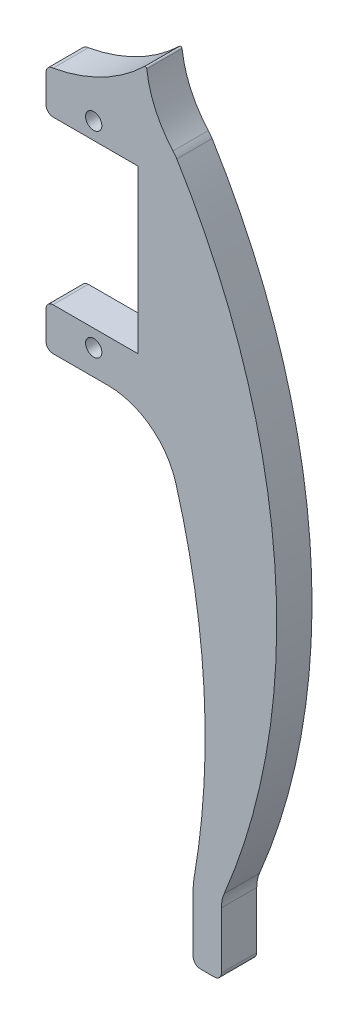
ISO-10303-21;
HEADER;
FILE_DESCRIPTION(('STEP AP214'),'2;1');
FILE_NAME('part.step','',(''),(''),'','','');
FILE_SCHEMA(('AUTOMOTIVE_DESIGN { 1 0 10303 214 1 1 1 1 }'));
ENDSEC;
DATA;
#1=APPLICATION_CONTEXT('core data for automotive mechanical design processes');
#2=APPLICATION_PROTOCOL_DEFINITION('international standard','automotive_design',2000,#1);
#3=PRODUCT_CONTEXT('',#1,'mechanical');
#4=PRODUCT('Part','Part','',(#3));
#5=PRODUCT_RELATED_PRODUCT_CATEGORY('part','',(#4));
#6=PRODUCT_DEFINITION_FORMATION('','',#4);
#7=PRODUCT_DEFINITION_CONTEXT('part definition',#1,'design');
#8=PRODUCT_DEFINITION('design','',#6,#7);
#9=PRODUCT_DEFINITION_SHAPE('','',#8);
#10=(LENGTH_UNIT() NAMED_UNIT(*) SI_UNIT(.MILLI.,.METRE.));
#11=(NAMED_UNIT(*) PLANE_ANGLE_UNIT() SI_UNIT($,.RADIAN.));
#12=(NAMED_UNIT(*) SI_UNIT($,.STERADIAN.) SOLID_ANGLE_UNIT());
#13=UNCERTAINTY_MEASURE_WITH_UNIT(LENGTH_MEASURE(1.E-05),#10,'distance_accuracy_value','');
#14=(GEOMETRIC_REPRESENTATION_CONTEXT(3) GLOBAL_UNCERTAINTY_ASSIGNED_CONTEXT((#13)) GLOBAL_UNIT_ASSIGNED_CONTEXT((#10,
#11,#12)) REPRESENTATION_CONTEXT('',''));
#15=CARTESIAN_POINT('',(0.,0.,0.));
#16=DIRECTION('',(0.,0.,1.));
#17=DIRECTION('',(1.,0.,0.));
#18=AXIS2_PLACEMENT_3D('',#15,#16,#17);
#19=CARTESIAN_POINT('',(-6.5,0.,5.));
#20=DIRECTION('',(-1.,0.,0.));
#21=DIRECTION('',(0.,0.,1.));
#22=AXIS2_PLACEMENT_3D('',#19,#20,#21);
#23=PLANE('',#22);
#24=DIRECTION('',(0.,1.,0.));
#25=VECTOR('',#24,1.);
#26=CARTESIAN_POINT('',(-6.5,0.,0.));
#27=LINE('',#26,#25);
#28=CARTESIAN_POINT('',(-6.5,12.5,0.));
#29=VERTEX_POINT('',#28);
#30=CARTESIAN_POINT('',(-6.5,16.5,0.));
#31=VERTEX_POINT('',#30);
#32=EDGE_CURVE('E302',#29,#31,#27,.T.);
#33=ORIENTED_EDGE('',*,*,#32,.F.);
#34=DIRECTION('',(0.,0.,-1.));
#35=VECTOR('',#34,1.);
#36=CARTESIAN_POINT('',(-6.5,12.5,5.));
#37=LINE('',#36,#35);
#38=CARTESIAN_POINT('',(-6.5,12.5,5.));
#39=VERTEX_POINT('',#38);
#40=EDGE_CURVE('E223',#29,#39,#37,.F.);
#41=ORIENTED_EDGE('',*,*,#40,.T.);
#42=DIRECTION('',(0.,1.,0.));
#43=VECTOR('',#42,1.);
#44=CARTESIAN_POINT('',(-6.5,0.,5.));
#45=LINE('',#44,#43);
#46=CARTESIAN_POINT('',(-6.5,16.5,5.));
#47=VERTEX_POINT('',#46);
#48=EDGE_CURVE('E308',#39,#47,#45,.T.);
#49=ORIENTED_EDGE('',*,*,#48,.T.);
#50=DIRECTION('',(0.,0.,-1.));
#51=VECTOR('',#50,1.);
#52=CARTESIAN_POINT('',(-6.5,16.5,5.));
#53=LINE('',#52,#51);
#54=EDGE_CURVE('E215',#47,#31,#53,.T.);
#55=ORIENTED_EDGE('',*,*,#54,.T.);
#56=EDGE_LOOP('',(#33,#41,#49,#55));
#57=FACE_BOUND('',#56,.T.);
#58=ADVANCED_FACE('F37',(#57),#23,.T.);
#59=CARTESIAN_POINT('',(0.,11.5,5.));
#60=DIRECTION('',(0.,1.,0.));
#61=DIRECTION('',(0.,0.,1.));
#62=AXIS2_PLACEMENT_3D('',#59,#60,#61);
#63=PLANE('',#62);
#64=DIRECTION('',(1.,0.,0.));
#65=VECTOR('',#64,1.);
#66=CARTESIAN_POINT('',(0.,11.5,5.));
#67=LINE('',#66,#65);
#68=CARTESIAN_POINT('',(-5.5,11.5,5.));
#69=VERTEX_POINT('',#68);
#70=CARTESIAN_POINT('',(6.5,11.5,5.));
#71=VERTEX_POINT('',#70);
#72=EDGE_CURVE('E310',#69,#71,#67,.T.);
#73=ORIENTED_EDGE('',*,*,#72,.F.);
#74=DIRECTION('',(0.,0.,-1.));
#75=VECTOR('',#74,1.);
#76=CARTESIAN_POINT('',(-5.5,11.5,0.));
#77=LINE('',#76,#75);
#78=CARTESIAN_POINT('',(-5.5,11.5,0.));
#79=VERTEX_POINT('',#78);
#80=EDGE_CURVE('E396',#69,#79,#77,.T.);
#81=ORIENTED_EDGE('',*,*,#80,.T.);
#82=DIRECTION('',(1.,0.,0.));
#83=VECTOR('',#82,1.);
#84=CARTESIAN_POINT('',(0.,11.5,0.));
#85=LINE('',#84,#83);
#86=CARTESIAN_POINT('',(6.5,11.5,0.));
#87=VERTEX_POINT('',#86);
#88=EDGE_CURVE('E339',#79,#87,#85,.T.);
#89=ORIENTED_EDGE('',*,*,#88,.T.);
#90=DIRECTION('',(0.,0.,-1.));
#91=VECTOR('',#90,1.);
#92=CARTESIAN_POINT('',(6.5,11.5,5.));
#93=LINE('',#92,#91);
#94=EDGE_CURVE('E366',#71,#87,#93,.T.);
#95=ORIENTED_EDGE('',*,*,#94,.F.);
#96=EDGE_LOOP('',(#73,#81,#89,#95));
#97=FACE_BOUND('',#96,.T.);
#98=ADVANCED_FACE('F409',(#97),#63,.F.);
#99=CARTESIAN_POINT('',(6.5,0.,5.));
#100=DIRECTION('',(1.,0.,0.));
#101=DIRECTION('',(0.,1.,0.));
#102=AXIS2_PLACEMENT_3D('',#99,#100,#101);
#103=PLANE('',#102);
#104=DIRECTION('',(0.,-1.,0.));
#105=VECTOR('',#104,1.);
#106=CARTESIAN_POINT('',(6.5,0.,0.));
#107=LINE('',#106,#105);
#108=CARTESIAN_POINT('',(6.5,-11.5,0.));
#109=VERTEX_POINT('',#108);
#110=EDGE_CURVE('E341',#87,#109,#107,.T.);
#111=ORIENTED_EDGE('',*,*,#110,.T.);
#112=DIRECTION('',(0.,0.,-1.));
#113=VECTOR('',#112,1.);
#114=CARTESIAN_POINT('',(6.5,-11.5,5.));
#115=LINE('',#114,#113);
#116=CARTESIAN_POINT('',(6.5,-11.5,5.));
#117=VERTEX_POINT('',#116);
#118=EDGE_CURVE('E337',#117,#109,#115,.T.);
#119=ORIENTED_EDGE('',*,*,#118,.F.);
#120=DIRECTION('',(0.,-1.,0.));
#121=VECTOR('',#120,1.);
#122=CARTESIAN_POINT('',(6.5,0.,5.));
#123=LINE('',#122,#121);
#124=EDGE_CURVE('E313',#71,#117,#123,.T.);
#125=ORIENTED_EDGE('',*,*,#124,.F.);
#126=ORIENTED_EDGE('',*,*,#94,.T.);
#127=EDGE_LOOP('',(#111,#119,#125,#126));
#128=FACE_BOUND('',#127,.T.);
#129=ADVANCED_FACE('F416',(#128),#103,.F.);
#130=CARTESIAN_POINT('',(0.,-11.5,5.));
#131=DIRECTION('',(0.,1.,0.));
#132=DIRECTION('',(0.,0.,1.));
#133=AXIS2_PLACEMENT_3D('',#130,#131,#132);
#134=PLANE('',#133);
#135=DIRECTION('',(1.,0.,0.));
#136=VECTOR('',#135,1.);
#137=CARTESIAN_POINT('',(0.,-11.5,0.));
#138=LINE('',#137,#136);
#139=CARTESIAN_POINT('',(-5.5,-11.5,0.));
#140=VERTEX_POINT('',#139);
#141=EDGE_CURVE('E344',#140,#109,#138,.T.);
#142=ORIENTED_EDGE('',*,*,#141,.F.);
#143=DIRECTION('',(0.,0.,-1.));
#144=VECTOR('',#143,1.);
#145=CARTESIAN_POINT('',(-5.5,-11.5,5.));
#146=LINE('',#145,#144);
#147=CARTESIAN_POINT('',(-5.5,-11.5,5.));
#148=VERTEX_POINT('',#147);
#149=EDGE_CURVE('E394',#140,#148,#146,.F.);
#150=ORIENTED_EDGE('',*,*,#149,.T.);
#151=DIRECTION('',(1.,0.,0.));
#152=VECTOR('',#151,1.);
#153=CARTESIAN_POINT('',(0.,-11.5,5.));
#154=LINE('',#153,#152);
#155=EDGE_CURVE('E316',#148,#117,#154,.T.);
#156=ORIENTED_EDGE('',*,*,#155,.T.);
#157=ORIENTED_EDGE('',*,*,#118,.T.);
#158=EDGE_LOOP('',(#142,#150,#156,#157));
#159=FACE_BOUND('',#158,.T.);
#160=ADVANCED_FACE('F419',(#159),#134,.T.);
#161=CARTESIAN_POINT('',(-6.5,0.,5.));
#162=DIRECTION('',(1.,0.,0.));
#163=DIRECTION('',(0.,1.,0.));
#164=AXIS2_PLACEMENT_3D('',#161,#162,#163);
#165=PLANE('',#164);
#166=DIRECTION('',(0.,-1.,0.));
#167=VECTOR('',#166,1.);
#168=CARTESIAN_POINT('',(-6.5,0.,0.));
#169=LINE('',#168,#167);
#170=CARTESIAN_POINT('',(-6.5,-12.5,0.));
#171=VERTEX_POINT('',#170);
#172=CARTESIAN_POINT('',(-6.5,-16.5,0.));
#173=VERTEX_POINT('',#172);
#174=EDGE_CURVE('E346',#171,#173,#169,.T.);
#175=ORIENTED_EDGE('',*,*,#174,.T.);
#176=DIRECTION('',(0.,0.,-1.));
#177=VECTOR('',#176,1.);
#178=CARTESIAN_POINT('',(-6.5,-16.5,5.));
#179=LINE('',#178,#177);
#180=CARTESIAN_POINT('',(-6.5,-16.5,5.));
#181=VERTEX_POINT('',#180);
#182=EDGE_CURVE('E217',#173,#181,#179,.F.);
#183=ORIENTED_EDGE('',*,*,#182,.T.);
#184=DIRECTION('',(0.,-1.,0.));
#185=VECTOR('',#184,1.);
#186=CARTESIAN_POINT('',(-6.5,0.,5.));
#187=LINE('',#186,#185);
#188=CARTESIAN_POINT('',(-6.5,-12.5,5.));
#189=VERTEX_POINT('',#188);
#190=EDGE_CURVE('E318',#189,#181,#187,.T.);
#191=ORIENTED_EDGE('',*,*,#190,.F.);
#192=DIRECTION('',(0.,0.,-1.));
#193=VECTOR('',#192,1.);
#194=CARTESIAN_POINT('',(-6.5,-12.5,0.));
#195=LINE('',#194,#193);
#196=EDGE_CURVE('E385',#189,#171,#195,.T.);
#197=ORIENTED_EDGE('',*,*,#196,.T.);
#198=EDGE_LOOP('',(#175,#183,#191,#197));
#199=FACE_BOUND('',#198,.T.);
#200=ADVANCED_FACE('F427',(#199),#165,.F.);
#201=CARTESIAN_POINT('',(0.,-17.5,5.));
#202=DIRECTION('',(0.,1.,0.));
#203=DIRECTION('',(0.,0.,1.));
#204=AXIS2_PLACEMENT_3D('',#201,#202,#203);
#205=PLANE('',#204);
#206=DIRECTION('',(1.,0.,0.));
#207=VECTOR('',#206,1.);
#208=CARTESIAN_POINT('',(0.,-17.5,0.));
#209=LINE('',#208,#207);
#210=CARTESIAN_POINT('',(-5.5,-17.5,0.));
#211=VERTEX_POINT('',#210);
#212=CARTESIAN_POINT('',(2.28345078270827,-17.5,0.));
#213=VERTEX_POINT('',#212);
#214=EDGE_CURVE('E349',#211,#213,#209,.T.);
#215=ORIENTED_EDGE('',*,*,#214,.T.);
#216=DIRECTION('',(0.,0.,1.));
#217=VECTOR('',#216,1.);
#218=CARTESIAN_POINT('',(2.28345078270827,-17.5,5.));
#219=LINE('',#218,#217);
#220=CARTESIAN_POINT('',(2.28345078270827,-17.5,5.));
#221=VERTEX_POINT('',#220);
#222=EDGE_CURVE('E270',#213,#221,#219,.T.);
#223=ORIENTED_EDGE('',*,*,#222,.T.);
#224=DIRECTION('',(1.,0.,0.));
#225=VECTOR('',#224,1.);
#226=CARTESIAN_POINT('',(0.,-17.5,5.));
#227=LINE('',#226,#225);
#228=CARTESIAN_POINT('',(-5.5,-17.5,5.));
#229=VERTEX_POINT('',#228);
#230=EDGE_CURVE('E321',#229,#221,#227,.T.);
#231=ORIENTED_EDGE('',*,*,#230,.F.);
#232=DIRECTION('',(0.,0.,-1.));
#233=VECTOR('',#232,1.);
#234=CARTESIAN_POINT('',(-5.5,-17.5,5.));
#235=LINE('',#234,#233);
#236=EDGE_CURVE('E375',#229,#211,#235,.T.);
#237=ORIENTED_EDGE('',*,*,#236,.T.);
#238=EDGE_LOOP('',(#215,#223,#231,#237));
#239=FACE_BOUND('',#238,.T.);
#240=ADVANCED_FACE('F436',(#239),#205,.F.);
#241=CARTESIAN_POINT('',(-88.0018123675898,-53.7710248991929,5.));
#242=DIRECTION('',(0.,0.,-1.));
#243=DIRECTION('',(-1.,0.,0.));
#244=AXIS2_PLACEMENT_3D('',#241,#242,#243);
#245=CYLINDRICAL_SURFACE('',#244,104.029758541499);
#246=CARTESIAN_POINT('',(-88.0018123675898,-53.7710248991929,5.));
#247=DIRECTION('',(0.,0.,1.));
#248=DIRECTION('',(1.,0.,0.));
#249=AXIS2_PLACEMENT_3D('',#246,#247,#248);
#250=CIRCLE('',#249,104.029758541499);
#251=CARTESIAN_POINT('',(11.8852262791807,-24.7060946123138,5.));
#252=VERTEX_POINT('',#251);
#253=CARTESIAN_POINT('',(14.4771935297143,-71.6663877762868,5.));
#254=VERTEX_POINT('',#253);
#255=EDGE_CURVE('E324',#252,#254,#250,.F.);
#256=ORIENTED_EDGE('',*,*,#255,.F.);
#257=DIRECTION('',(0.,0.,-1.));
#258=VECTOR('',#257,1.);
#259=CARTESIAN_POINT('',(11.8852262791807,-24.7060946123138,5.));
#260=LINE('',#259,#258);
#261=CARTESIAN_POINT('',(11.8852262791807,-24.7060946123138,0.));
#262=VERTEX_POINT('',#261);
#263=EDGE_CURVE('E267',#252,#262,#260,.T.);
#264=ORIENTED_EDGE('',*,*,#263,.T.);
#265=CARTESIAN_POINT('',(-88.0018123675898,-53.7710248991929,0.));
#266=DIRECTION('',(0.,0.,1.));
#267=DIRECTION('',(1.,0.,0.));
#268=AXIS2_PLACEMENT_3D('',#265,#266,#267);
#269=CIRCLE('',#268,104.029758541499);
#270=CARTESIAN_POINT('',(14.4771935297143,-71.6663877762868,0.));
#271=VERTEX_POINT('',#270);
#272=EDGE_CURVE('E352',#262,#271,#269,.F.);
#273=ORIENTED_EDGE('',*,*,#272,.T.);
#274=DIRECTION('',(0.,0.,-1.));
#275=VECTOR('',#274,1.);
#276=CARTESIAN_POINT('',(14.4771935297143,-71.6663877762868,5.));
#277=LINE('',#276,#275);
#278=EDGE_CURVE('E262',#271,#254,#277,.F.);
#279=ORIENTED_EDGE('',*,*,#278,.T.);
#280=EDGE_LOOP('',(#256,#264,#273,#279));
#281=FACE_BOUND('',#280,.T.);
#282=ADVANCED_FACE('F444',(#281),#245,.F.);
#283=CARTESIAN_POINT('',(14.3281253528836,0.,5.));
#284=DIRECTION('',(1.,0.,0.));
#285=DIRECTION('',(0.,1.,0.));
#286=AXIS2_PLACEMENT_3D('',#283,#284,#285);
#287=PLANE('',#286);
#288=DIRECTION('',(0.,-1.,0.));
#289=VECTOR('',#288,1.);
#290=CARTESIAN_POINT('',(14.3281253528836,0.,5.));
#291=LINE('',#290,#289);
#292=CARTESIAN_POINT('',(14.3281253528833,-73.3866035230104,5.));
#293=VERTEX_POINT('',#292);
#294=CARTESIAN_POINT('',(14.3281253528833,-81.5,5.));
#295=VERTEX_POINT('',#294);
#296=EDGE_CURVE('E326',#293,#295,#291,.T.);
#297=ORIENTED_EDGE('',*,*,#296,.F.);
#298=DIRECTION('',(0.,0.,-1.));
#299=VECTOR('',#298,1.);
#300=CARTESIAN_POINT('',(14.3281253528833,-73.3866035230104,5.));
#301=LINE('',#300,#299);
#302=CARTESIAN_POINT('',(14.3281253528833,-73.3866035230104,0.));
#303=VERTEX_POINT('',#302);
#304=EDGE_CURVE('E256',#293,#303,#301,.T.);
#305=ORIENTED_EDGE('',*,*,#304,.T.);
#306=DIRECTION('',(0.,-1.,0.));
#307=VECTOR('',#306,1.);
#308=CARTESIAN_POINT('',(14.3281253528836,0.,0.));
#309=LINE('',#308,#307);
#310=CARTESIAN_POINT('',(14.3281253528833,-81.5,0.));
#311=VERTEX_POINT('',#310);
#312=EDGE_CURVE('E354',#303,#311,#309,.T.);
#313=ORIENTED_EDGE('',*,*,#312,.T.);
#314=DIRECTION('',(0.,0.,-1.));
#315=VECTOR('',#314,1.);
#316=CARTESIAN_POINT('',(14.3281253528833,-81.5,5.));
#317=LINE('',#316,#315);
#318=EDGE_CURVE('E253',#311,#295,#317,.F.);
#319=ORIENTED_EDGE('',*,*,#318,.T.);
#320=EDGE_LOOP('',(#297,#305,#313,#319));
#321=FACE_BOUND('',#320,.T.);
#322=ADVANCED_FACE('F453',(#321),#287,.F.);
#323=CARTESIAN_POINT('',(0.,-82.5,5.));
#324=DIRECTION('',(0.,1.,0.));
#325=DIRECTION('',(0.,0.,1.));
#326=AXIS2_PLACEMENT_3D('',#323,#324,#325);
#327=PLANE('',#326);
#328=DIRECTION('',(1.,0.,0.));
#329=VECTOR('',#328,1.);
#330=CARTESIAN_POINT('',(0.,-82.5,0.));
#331=LINE('',#330,#329);
#332=CARTESIAN_POINT('',(15.3281253528833,-82.5,0.));
#333=VERTEX_POINT('',#332);
#334=CARTESIAN_POINT('',(17.3281253528833,-82.5,0.));
#335=VERTEX_POINT('',#334);
#336=EDGE_CURVE('E356',#333,#335,#331,.T.);
#337=ORIENTED_EDGE('',*,*,#336,.T.);
#338=DIRECTION('',(0.,0.,-1.));
#339=VECTOR('',#338,1.);
#340=CARTESIAN_POINT('',(17.3281253528833,-82.5,5.));
#341=LINE('',#340,#339);
#342=CARTESIAN_POINT('',(17.3281253528833,-82.5,5.));
#343=VERTEX_POINT('',#342);
#344=EDGE_CURVE('E247',#335,#343,#341,.F.);
#345=ORIENTED_EDGE('',*,*,#344,.T.);
#346=DIRECTION('',(1.,0.,0.));
#347=VECTOR('',#346,1.);
#348=CARTESIAN_POINT('',(0.,-82.5,5.));
#349=LINE('',#348,#347);
#350=CARTESIAN_POINT('',(15.3281253528833,-82.5,5.));
#351=VERTEX_POINT('',#350);
#352=EDGE_CURVE('E328',#351,#343,#349,.T.);
#353=ORIENTED_EDGE('',*,*,#352,.F.);
#354=DIRECTION('',(0.,0.,-1.));
#355=VECTOR('',#354,1.);
#356=CARTESIAN_POINT('',(15.3281253528833,-82.5,5.));
#357=LINE('',#356,#355);
#358=EDGE_CURVE('E244',#351,#333,#357,.T.);
#359=ORIENTED_EDGE('',*,*,#358,.T.);
#360=EDGE_LOOP('',(#337,#345,#353,#359));
#361=FACE_BOUND('',#360,.T.);
#362=ADVANCED_FACE('F463',(#361),#327,.F.);
#363=CARTESIAN_POINT('',(18.3281253528833,0.,5.));
#364=DIRECTION('',(1.,0.,0.));
#365=DIRECTION('',(0.,0.,-1.));
#366=AXIS2_PLACEMENT_3D('',#363,#364,#365);
#367=PLANE('',#366);
#368=DIRECTION('',(0.,-1.,0.));
#369=VECTOR('',#368,1.);
#370=CARTESIAN_POINT('',(18.3281253528833,0.,5.));
#371=LINE('',#370,#369);
#372=CARTESIAN_POINT('',(18.3281253528833,-73.5224752216835,5.));
#373=VERTEX_POINT('',#372);
#374=CARTESIAN_POINT('',(18.3281253528833,-81.5,5.));
#375=VERTEX_POINT('',#374);
#376=EDGE_CURVE('E331',#373,#375,#371,.T.);
#377=ORIENTED_EDGE('',*,*,#376,.T.);
#378=DIRECTION('',(0.,0.,-1.));
#379=VECTOR('',#378,1.);
#380=CARTESIAN_POINT('',(18.3281253528833,-81.5,0.));
#381=LINE('',#380,#379);
#382=CARTESIAN_POINT('',(18.3281253528833,-81.5,0.));
#383=VERTEX_POINT('',#382);
#384=EDGE_CURVE('E236',#375,#383,#381,.T.);
#385=ORIENTED_EDGE('',*,*,#384,.T.);
#386=DIRECTION('',(0.,-1.,0.));
#387=VECTOR('',#386,1.);
#388=CARTESIAN_POINT('',(18.3281253528833,0.,0.));
#389=LINE('',#388,#387);
#390=CARTESIAN_POINT('',(18.3281253528833,-73.5224752216835,0.));
#391=VERTEX_POINT('',#390);
#392=EDGE_CURVE('E359',#391,#383,#389,.T.);
#393=ORIENTED_EDGE('',*,*,#392,.F.);
#394=DIRECTION('',(0.,0.,1.));
#395=VECTOR('',#394,1.);
#396=CARTESIAN_POINT('',(18.3281253528833,-73.5224752216835,5.));
#397=LINE('',#396,#395);
#398=EDGE_CURVE('E226',#391,#373,#397,.T.);
#399=ORIENTED_EDGE('',*,*,#398,.T.);
#400=EDGE_LOOP('',(#377,#385,#393,#399));
#401=FACE_BOUND('',#400,.T.);
#402=ADVANCED_FACE('F472',(#401),#367,.T.);
#403=CARTESIAN_POINT('',(-68.8459826463385,-34.7418896852608,5.));
#404=DIRECTION('',(0.,0.,-1.));
#405=DIRECTION('',(-1.,0.,0.));
#406=AXIS2_PLACEMENT_3D('',#403,#404,#405);
#407=CYLINDRICAL_SURFACE('',#406,95.);
#408=CARTESIAN_POINT('',(-68.8459826463385,-34.7418896852608,5.));
#409=DIRECTION('',(0.,0.,1.));
#410=DIRECTION('',(1.,0.,0.));
#411=AXIS2_PLACEMENT_3D('',#408,#409,#410);
#412=CIRCLE('',#411,95.);
#413=CARTESIAN_POINT('',(12.0140090075523,15.1245494269589,5.));
#414=VERTEX_POINT('',#413);
#415=CARTESIAN_POINT('',(18.7194199529222,-71.5834459448623,5.));
#416=VERTEX_POINT('',#415);
#417=EDGE_CURVE('E334',#414,#416,#412,.F.);
#418=ORIENTED_EDGE('',*,*,#417,.T.);
#419=DIRECTION('',(0.,0.,-1.));
#420=VECTOR('',#419,1.);
#421=CARTESIAN_POINT('',(18.7194199529222,-71.5834459448623,5.));
#422=LINE('',#421,#420);
#423=CARTESIAN_POINT('',(18.7194199529222,-71.5834459448623,0.));
#424=VERTEX_POINT('',#423);
#425=EDGE_CURVE('E222',#416,#424,#422,.T.);
#426=ORIENTED_EDGE('',*,*,#425,.T.);
#427=CARTESIAN_POINT('',(-68.8459826463385,-34.7418896852608,0.));
#428=DIRECTION('',(0.,0.,1.));
#429=DIRECTION('',(1.,0.,0.));
#430=AXIS2_PLACEMENT_3D('',#427,#428,#429);
#431=CIRCLE('',#430,95.);
#432=CARTESIAN_POINT('',(12.0140090075523,15.1245494269589,0.));
#433=VERTEX_POINT('',#432);
#434=EDGE_CURVE('E311',#433,#424,#431,.F.);
#435=ORIENTED_EDGE('',*,*,#434,.F.);
#436=DIRECTION('',(0.,0.,-1.));
#437=VECTOR('',#436,1.);
#438=CARTESIAN_POINT('',(12.0140090075523,15.1245494269589,5.));
#439=LINE('',#438,#437);
#440=EDGE_CURVE('E371',#433,#414,#439,.F.);
#441=ORIENTED_EDGE('',*,*,#440,.T.);
#442=EDGE_LOOP('',(#418,#426,#435,#441));
#443=FACE_BOUND('',#442,.T.);
#444=ADVANCED_FACE('F480',(#443),#407,.T.);
#445=CARTESIAN_POINT('',(0.,0.,5.));
#446=DIRECTION('',(0.,0.,1.));
#447=DIRECTION('',(1.,0.,0.));
#448=AXIS2_PLACEMENT_3D('',#445,#446,#447);
#449=PLANE('',#448);
#450=CARTESIAN_POINT('',(0.249999999999999,13.9,5.));
#451=DIRECTION('',(0.,0.,1.));
#452=DIRECTION('',(1.,0.,0.));
#453=AXIS2_PLACEMENT_3D('',#450,#451,#452);
#454=CIRCLE('',#453,1.15);
#455=CARTESIAN_POINT('',(1.4,13.9,5.));
#456=VERTEX_POINT('',#455);
#457=EDGE_CURVE('E303',#456,#456,#454,.T.);
#458=ORIENTED_EDGE('',*,*,#457,.F.);
#459=EDGE_LOOP('',(#458));
#460=FACE_BOUND('',#459,.T.);
#461=CARTESIAN_POINT('',(0.249999999999999,-13.9,5.));
#462=DIRECTION('',(0.,0.,1.));
#463=DIRECTION('',(1.,0.,0.));
#464=AXIS2_PLACEMENT_3D('',#461,#462,#463);
#465=CIRCLE('',#464,1.15);
#466=CARTESIAN_POINT('',(1.4,-13.9,5.));
#467=VERTEX_POINT('',#466);
#468=EDGE_CURVE('E293',#467,#467,#465,.T.);
#469=ORIENTED_EDGE('',*,*,#468,.F.);
#470=EDGE_LOOP('',(#469));
#471=FACE_BOUND('',#470,.T.);
#472=CARTESIAN_POINT('',(7.75821997313698,12.5,5.));
#473=DIRECTION('',(0.,0.,1.));
#474=DIRECTION('',(1.,0.,0.));
#475=AXIS2_PLACEMENT_3D('',#472,#473,#474);
#476=CIRCLE('',#475,5.);
#477=CARTESIAN_POINT('',(11.4804823789559,15.8383772378548,5.));
#478=VERTEX_POINT('',#477);
#479=EDGE_CURVE('E373',#414,#478,#476,.T.);
#480=ORIENTED_EDGE('',*,*,#479,.T.);
#481=CARTESIAN_POINT('',(22.6472695964127,25.8535089514193,5.));
#482=DIRECTION('',(0.,0.,1.));
#483=DIRECTION('',(1.,0.,0.));
#484=AXIS2_PLACEMENT_3D('',#481,#482,#483);
#485=CIRCLE('',#484,15.);
#486=CARTESIAN_POINT('',(7.75676009975903,24.0444409786586,5.));
#487=VERTEX_POINT('',#486);
#488=EDGE_CURVE('E11',#478,#487,#485,.F.);
#489=ORIENTED_EDGE('',*,*,#488,.T.);
#490=CARTESIAN_POINT('',(7.55821997313699,24.0203200723552,5.));
#491=DIRECTION('',(0.,0.,1.));
#492=DIRECTION('',(1.,0.,0.));
#493=AXIS2_PLACEMENT_3D('',#490,#491,#492);
#494=CIRCLE('',#493,0.2);
#495=CARTESIAN_POINT('',(7.41882018568872,24.163734504193,5.));
#496=VERTEX_POINT('',#495);
#497=EDGE_CURVE('E203',#487,#496,#494,.T.);
#498=ORIENTED_EDGE('',*,*,#497,.T.);
#499=CARTESIAN_POINT('',(-10.0061532453444,42.0905384839265,5.));
#500=DIRECTION('',(0.,0.,-1.));
#501=DIRECTION('',(1.,0.,0.));
#502=AXIS2_PLACEMENT_3D('',#499,#500,#501);
#503=CIRCLE('',#502,25.);
#504=CARTESIAN_POINT('',(-5.5,17.5,5.));
#505=VERTEX_POINT('',#504);
#506=EDGE_CURVE('E196',#496,#505,#503,.T.);
#507=ORIENTED_EDGE('',*,*,#506,.T.);
#508=CARTESIAN_POINT('',(-5.5,16.5,5.));
#509=DIRECTION('',(0.,0.,1.));
#510=DIRECTION('',(1.,0.,0.));
#511=AXIS2_PLACEMENT_3D('',#508,#509,#510);
#512=CIRCLE('',#511,1.);
#513=EDGE_CURVE('E200',#505,#47,#512,.T.);
#514=ORIENTED_EDGE('',*,*,#513,.T.);
#515=ORIENTED_EDGE('',*,*,#48,.F.);
#516=CARTESIAN_POINT('',(-5.5,12.5,5.));
#517=DIRECTION('',(0.,0.,1.));
#518=DIRECTION('',(1.,0.,0.));
#519=AXIS2_PLACEMENT_3D('',#516,#517,#518);
#520=CIRCLE('',#519,1.);
#521=EDGE_CURVE('E216',#39,#69,#520,.T.);
#522=ORIENTED_EDGE('',*,*,#521,.T.);
#523=ORIENTED_EDGE('',*,*,#72,.T.);
#524=ORIENTED_EDGE('',*,*,#124,.T.);
#525=ORIENTED_EDGE('',*,*,#155,.F.);
#526=CARTESIAN_POINT('',(-5.5,-12.5,5.));
#527=DIRECTION('',(0.,0.,1.));
#528=DIRECTION('',(1.,0.,0.));
#529=AXIS2_PLACEMENT_3D('',#526,#527,#528);
#530=CIRCLE('',#529,1.);
#531=EDGE_CURVE('E390',#148,#189,#530,.T.);
#532=ORIENTED_EDGE('',*,*,#531,.T.);
#533=ORIENTED_EDGE('',*,*,#190,.T.);
#534=CARTESIAN_POINT('',(-5.5,-16.5,5.));
#535=DIRECTION('',(0.,0.,1.));
#536=DIRECTION('',(1.,0.,0.));
#537=AXIS2_PLACEMENT_3D('',#534,#535,#536);
#538=CIRCLE('',#537,1.);
#539=EDGE_CURVE('E392',#181,#229,#538,.T.);
#540=ORIENTED_EDGE('',*,*,#539,.T.);
#541=ORIENTED_EDGE('',*,*,#230,.T.);
#542=CARTESIAN_POINT('',(2.28345078270827,-27.5,5.));
#543=DIRECTION('',(0.,0.,1.));
#544=DIRECTION('',(1.,0.,0.));
#545=AXIS2_PLACEMENT_3D('',#542,#543,#544);
#546=CIRCLE('',#545,10.);
#547=EDGE_CURVE('E274',#221,#252,#546,.F.);
#548=ORIENTED_EDGE('',*,*,#547,.T.);
#549=ORIENTED_EDGE('',*,*,#255,.T.);
#550=CARTESIAN_POINT('',(24.3281253528833,-73.3866035230104,5.));
#551=DIRECTION('',(0.,0.,1.));
#552=DIRECTION('',(1.,0.,0.));
#553=AXIS2_PLACEMENT_3D('',#550,#551,#552);
#554=CIRCLE('',#553,10.);
#555=EDGE_CURVE('E265',#254,#293,#554,.T.);
#556=ORIENTED_EDGE('',*,*,#555,.T.);
#557=ORIENTED_EDGE('',*,*,#296,.T.);
#558=CARTESIAN_POINT('',(15.3281253528833,-81.5,5.));
#559=DIRECTION('',(0.,0.,1.));
#560=DIRECTION('',(1.,0.,0.));
#561=AXIS2_PLACEMENT_3D('',#558,#559,#560);
#562=CIRCLE('',#561,1.);
#563=EDGE_CURVE('E249',#295,#351,#562,.T.);
#564=ORIENTED_EDGE('',*,*,#563,.T.);
#565=ORIENTED_EDGE('',*,*,#352,.T.);
#566=CARTESIAN_POINT('',(17.3281253528833,-81.5,5.));
#567=DIRECTION('',(0.,0.,1.));
#568=DIRECTION('',(1.,0.,0.));
#569=AXIS2_PLACEMENT_3D('',#566,#567,#568);
#570=CIRCLE('',#569,1.);
#571=EDGE_CURVE('E251',#343,#375,#570,.T.);
#572=ORIENTED_EDGE('',*,*,#571,.T.);
#573=ORIENTED_EDGE('',*,*,#376,.F.);
#574=CARTESIAN_POINT('',(23.3281253528833,-73.5224752216835,5.));
#575=DIRECTION('',(0.,0.,1.));
#576=DIRECTION('',(1.,0.,0.));
#577=AXIS2_PLACEMENT_3D('',#574,#575,#576);
#578=CIRCLE('',#577,5.);
#579=EDGE_CURVE('E234',#373,#416,#578,.F.);
#580=ORIENTED_EDGE('',*,*,#579,.T.);
#581=ORIENTED_EDGE('',*,*,#417,.F.);
#582=EDGE_LOOP('',(#480,#489,#498,#507,#514,#515,#522,#523,#524,#525,#532,#533,#540,#541,#548,
#549,#556,#557,#564,#565,#572,#573,#580,#581));
#583=FACE_BOUND('',#582,.T.);
#584=ADVANCED_FACE('F198',(#460,#471,#583),#449,.T.);
#585=CARTESIAN_POINT('',(0.,0.,0.));
#586=DIRECTION('',(0.,0.,1.));
#587=DIRECTION('',(1.,0.,0.));
#588=AXIS2_PLACEMENT_3D('',#585,#586,#587);
#589=PLANE('',#588);
#590=CARTESIAN_POINT('',(0.249999999999999,13.9,0.));
#591=DIRECTION('',(0.,0.,1.));
#592=DIRECTION('',(1.,0.,0.));
#593=AXIS2_PLACEMENT_3D('',#590,#591,#592);
#594=CIRCLE('',#593,1.15);
#595=CARTESIAN_POINT('',(1.4,13.9,0.));
#596=VERTEX_POINT('',#595);
#597=EDGE_CURVE('E299',#596,#596,#594,.T.);
#598=ORIENTED_EDGE('',*,*,#597,.T.);
#599=EDGE_LOOP('',(#598));
#600=FACE_BOUND('',#599,.T.);
#601=CARTESIAN_POINT('',(0.249999999999999,-13.9,0.));
#602=DIRECTION('',(0.,0.,1.));
#603=DIRECTION('',(1.,0.,0.));
#604=AXIS2_PLACEMENT_3D('',#601,#602,#603);
#605=CIRCLE('',#604,1.15);
#606=CARTESIAN_POINT('',(1.4,-13.9,0.));
#607=VERTEX_POINT('',#606);
#608=EDGE_CURVE('E296',#607,#607,#605,.T.);
#609=ORIENTED_EDGE('',*,*,#608,.T.);
#610=EDGE_LOOP('',(#609));
#611=FACE_BOUND('',#610,.T.);
#612=CARTESIAN_POINT('',(-10.0061532453444,42.0905384839265,0.));
#613=DIRECTION('',(0.,0.,-1.));
#614=DIRECTION('',(1.,0.,0.));
#615=AXIS2_PLACEMENT_3D('',#612,#613,#614);
#616=CIRCLE('',#615,25.);
#617=CARTESIAN_POINT('',(7.41882018568872,24.163734504193,0.));
#618=VERTEX_POINT('',#617);
#619=CARTESIAN_POINT('',(-5.5,17.5,0.));
#620=VERTEX_POINT('',#619);
#621=EDGE_CURVE('E207',#618,#620,#616,.T.);
#622=ORIENTED_EDGE('',*,*,#621,.F.);
#623=CARTESIAN_POINT('',(7.55821997313699,24.0203200723552,0.));
#624=DIRECTION('',(0.,0.,1.));
#625=DIRECTION('',(1.,0.,0.));
#626=AXIS2_PLACEMENT_3D('',#623,#624,#625);
#627=CIRCLE('',#626,0.2);
#628=CARTESIAN_POINT('',(7.75676009975903,24.0444409786586,0.));
#629=VERTEX_POINT('',#628);
#630=EDGE_CURVE('E279',#618,#629,#627,.F.);
#631=ORIENTED_EDGE('',*,*,#630,.T.);
#632=CARTESIAN_POINT('',(22.6472695964127,25.8535089514193,0.));
#633=DIRECTION('',(0.,0.,1.));
#634=DIRECTION('',(1.,0.,0.));
#635=AXIS2_PLACEMENT_3D('',#632,#633,#634);
#636=CIRCLE('',#635,15.);
#637=CARTESIAN_POINT('',(11.4804823789559,15.8383772378548,0.));
#638=VERTEX_POINT('',#637);
#639=EDGE_CURVE('E45',#629,#638,#636,.T.);
#640=ORIENTED_EDGE('',*,*,#639,.T.);
#641=CARTESIAN_POINT('',(7.75821997313698,12.5,0.));
#642=DIRECTION('',(0.,0.,1.));
#643=DIRECTION('',(1.,0.,0.));
#644=AXIS2_PLACEMENT_3D('',#641,#642,#643);
#645=CIRCLE('',#644,5.);
#646=EDGE_CURVE('E369',#638,#433,#645,.F.);
#647=ORIENTED_EDGE('',*,*,#646,.T.);
#648=ORIENTED_EDGE('',*,*,#434,.T.);
#649=CARTESIAN_POINT('',(23.3281253528833,-73.5224752216835,0.));
#650=DIRECTION('',(0.,0.,1.));
#651=DIRECTION('',(1.,0.,0.));
#652=AXIS2_PLACEMENT_3D('',#649,#650,#651);
#653=CIRCLE('',#652,5.);
#654=EDGE_CURVE('E232',#424,#391,#653,.T.);
#655=ORIENTED_EDGE('',*,*,#654,.T.);
#656=ORIENTED_EDGE('',*,*,#392,.T.);
#657=CARTESIAN_POINT('',(17.3281253528833,-81.5,0.));
#658=DIRECTION('',(0.,0.,1.));
#659=DIRECTION('',(1.,0.,0.));
#660=AXIS2_PLACEMENT_3D('',#657,#658,#659);
#661=CIRCLE('',#660,1.);
#662=EDGE_CURVE('E242',#383,#335,#661,.F.);
#663=ORIENTED_EDGE('',*,*,#662,.T.);
#664=ORIENTED_EDGE('',*,*,#336,.F.);
#665=CARTESIAN_POINT('',(15.3281253528833,-81.5,0.));
#666=DIRECTION('',(0.,0.,1.));
#667=DIRECTION('',(1.,0.,0.));
#668=AXIS2_PLACEMENT_3D('',#665,#666,#667);
#669=CIRCLE('',#668,1.);
#670=EDGE_CURVE('E239',#333,#311,#669,.F.);
#671=ORIENTED_EDGE('',*,*,#670,.T.);
#672=ORIENTED_EDGE('',*,*,#312,.F.);
#673=CARTESIAN_POINT('',(24.3281253528833,-73.3866035230104,0.));
#674=DIRECTION('',(0.,0.,1.));
#675=DIRECTION('',(1.,0.,0.));
#676=AXIS2_PLACEMENT_3D('',#673,#674,#675);
#677=CIRCLE('',#676,10.);
#678=EDGE_CURVE('E259',#303,#271,#677,.F.);
#679=ORIENTED_EDGE('',*,*,#678,.T.);
#680=ORIENTED_EDGE('',*,*,#272,.F.);
#681=CARTESIAN_POINT('',(2.28345078270827,-27.5,0.));
#682=DIRECTION('',(0.,0.,1.));
#683=DIRECTION('',(1.,0.,0.));
#684=AXIS2_PLACEMENT_3D('',#681,#682,#683);
#685=CIRCLE('',#684,10.);
#686=EDGE_CURVE('E272',#262,#213,#685,.T.);
#687=ORIENTED_EDGE('',*,*,#686,.T.);
#688=ORIENTED_EDGE('',*,*,#214,.F.);
#689=CARTESIAN_POINT('',(-5.5,-16.5,0.));
#690=DIRECTION('',(0.,0.,1.));
#691=DIRECTION('',(1.,0.,0.));
#692=AXIS2_PLACEMENT_3D('',#689,#690,#691);
#693=CIRCLE('',#692,1.);
#694=EDGE_CURVE('E383',#211,#173,#693,.F.);
#695=ORIENTED_EDGE('',*,*,#694,.T.);
#696=ORIENTED_EDGE('',*,*,#174,.F.);
#697=CARTESIAN_POINT('',(-5.5,-12.5,0.));
#698=DIRECTION('',(0.,0.,1.));
#699=DIRECTION('',(1.,0.,0.));
#700=AXIS2_PLACEMENT_3D('',#697,#698,#699);
#701=CIRCLE('',#700,1.);
#702=EDGE_CURVE('E381',#171,#140,#701,.F.);
#703=ORIENTED_EDGE('',*,*,#702,.T.);
#704=ORIENTED_EDGE('',*,*,#141,.T.);
#705=ORIENTED_EDGE('',*,*,#110,.F.);
#706=ORIENTED_EDGE('',*,*,#88,.F.);
#707=CARTESIAN_POINT('',(-5.5,12.5,0.));
#708=DIRECTION('',(0.,0.,1.));
#709=DIRECTION('',(1.,0.,0.));
#710=AXIS2_PLACEMENT_3D('',#707,#708,#709);
#711=CIRCLE('',#710,1.);
#712=EDGE_CURVE('E379',#79,#29,#711,.F.);
#713=ORIENTED_EDGE('',*,*,#712,.T.);
#714=ORIENTED_EDGE('',*,*,#32,.T.);
#715=CARTESIAN_POINT('',(-5.5,16.5,0.));
#716=DIRECTION('',(0.,0.,1.));
#717=DIRECTION('',(1.,0.,0.));
#718=AXIS2_PLACEMENT_3D('',#715,#716,#717);
#719=CIRCLE('',#718,1.);
#720=EDGE_CURVE('E292',#31,#620,#719,.F.);
#721=ORIENTED_EDGE('',*,*,#720,.T.);
#722=EDGE_LOOP('',(#622,#631,#640,#647,#648,#655,#656,#663,#664,#671,#672,#679,#680,#687,#688,
#695,#696,#703,#704,#705,#706,#713,#714,#721));
#723=FACE_BOUND('',#722,.T.);
#724=ADVANCED_FACE('F290',(#600,#611,#723),#589,.F.);
#725=CARTESIAN_POINT('',(0.249999999999999,-13.9,0.));
#726=DIRECTION('',(0.,0.,1.));
#727=DIRECTION('',(1.,0.,0.));
#728=AXIS2_PLACEMENT_3D('',#725,#726,#727);
#729=CYLINDRICAL_SURFACE('',#728,1.15);
#730=ORIENTED_EDGE('',*,*,#608,.F.);
#731=EDGE_LOOP('',(#730));
#732=FACE_BOUND('',#731,.T.);
#733=ORIENTED_EDGE('',*,*,#468,.T.);
#734=EDGE_LOOP('',(#733));
#735=FACE_BOUND('',#734,.T.);
#736=ADVANCED_FACE('F527',(#732,#735),#729,.F.);
#737=CARTESIAN_POINT('',(0.249999999999999,13.9,0.));
#738=DIRECTION('',(0.,0.,1.));
#739=DIRECTION('',(1.,0.,0.));
#740=AXIS2_PLACEMENT_3D('',#737,#738,#739);
#741=CYLINDRICAL_SURFACE('',#740,1.15);
#742=ORIENTED_EDGE('',*,*,#597,.F.);
#743=EDGE_LOOP('',(#742));
#744=FACE_BOUND('',#743,.T.);
#745=ORIENTED_EDGE('',*,*,#457,.T.);
#746=EDGE_LOOP('',(#745));
#747=FACE_BOUND('',#746,.T.);
#748=ADVANCED_FACE('F498',(#744,#747),#741,.F.);
#749=CARTESIAN_POINT('',(7.75821997313698,12.5,5.));
#750=DIRECTION('',(0.,0.,-1.));
#751=DIRECTION('',(-1.,0.,0.));
#752=AXIS2_PLACEMENT_3D('',#749,#750,#751);
#753=CYLINDRICAL_SURFACE('',#752,5.);
#754=ORIENTED_EDGE('',*,*,#646,.F.);
#755=DIRECTION('',(0.,0.,-1.));
#756=VECTOR('',#755,1.);
#757=CARTESIAN_POINT('',(11.4804823789559,15.8383772378548,5.));
#758=LINE('',#757,#756);
#759=EDGE_CURVE('E58',#638,#478,#758,.F.);
#760=ORIENTED_EDGE('',*,*,#759,.T.);
#761=ORIENTED_EDGE('',*,*,#479,.F.);
#762=ORIENTED_EDGE('',*,*,#440,.F.);
#763=EDGE_LOOP('',(#754,#760,#761,#762));
#764=FACE_BOUND('',#763,.T.);
#765=ADVANCED_FACE('F483',(#764),#753,.T.);
#766=CARTESIAN_POINT('',(-5.5,-16.5,5.));
#767=DIRECTION('',(0.,0.,-1.));
#768=DIRECTION('',(-1.,0.,0.));
#769=AXIS2_PLACEMENT_3D('',#766,#767,#768);
#770=CYLINDRICAL_SURFACE('',#769,1.);
#771=ORIENTED_EDGE('',*,*,#539,.F.);
#772=ORIENTED_EDGE('',*,*,#182,.F.);
#773=ORIENTED_EDGE('',*,*,#694,.F.);
#774=ORIENTED_EDGE('',*,*,#236,.F.);
#775=EDGE_LOOP('',(#771,#772,#773,#774));
#776=FACE_BOUND('',#775,.T.);
#777=ADVANCED_FACE('F431',(#776),#770,.T.);
#778=CARTESIAN_POINT('',(-5.5,-12.5,5.));
#779=DIRECTION('',(0.,0.,1.));
#780=DIRECTION('',(1.,0.,0.));
#781=AXIS2_PLACEMENT_3D('',#778,#779,#780);
#782=CYLINDRICAL_SURFACE('',#781,1.);
#783=ORIENTED_EDGE('',*,*,#531,.F.);
#784=ORIENTED_EDGE('',*,*,#149,.F.);
#785=ORIENTED_EDGE('',*,*,#702,.F.);
#786=ORIENTED_EDGE('',*,*,#196,.F.);
#787=EDGE_LOOP('',(#783,#784,#785,#786));
#788=FACE_BOUND('',#787,.T.);
#789=ADVANCED_FACE('F422',(#788),#782,.T.);
#790=CARTESIAN_POINT('',(-5.5,12.5,5.));
#791=DIRECTION('',(0.,0.,1.));
#792=DIRECTION('',(1.,0.,0.));
#793=AXIS2_PLACEMENT_3D('',#790,#791,#792);
#794=CYLINDRICAL_SURFACE('',#793,1.);
#795=ORIENTED_EDGE('',*,*,#521,.F.);
#796=ORIENTED_EDGE('',*,*,#40,.F.);
#797=ORIENTED_EDGE('',*,*,#712,.F.);
#798=ORIENTED_EDGE('',*,*,#80,.F.);
#799=EDGE_LOOP('',(#795,#796,#797,#798));
#800=FACE_BOUND('',#799,.T.);
#801=ADVANCED_FACE('F406',(#800),#794,.T.);
#802=CARTESIAN_POINT('',(-5.5,16.5,5.));
#803=DIRECTION('',(0.,0.,-1.));
#804=DIRECTION('',(-1.,0.,0.));
#805=AXIS2_PLACEMENT_3D('',#802,#803,#804);
#806=CYLINDRICAL_SURFACE('',#805,1.);
#807=ORIENTED_EDGE('',*,*,#513,.F.);
#808=DIRECTION('',(0.,0.,-1.));
#809=VECTOR('',#808,1.);
#810=CARTESIAN_POINT('',(-5.5,17.5,5.));
#811=LINE('',#810,#809);
#812=EDGE_CURVE('E213',#620,#505,#811,.F.);
#813=ORIENTED_EDGE('',*,*,#812,.F.);
#814=ORIENTED_EDGE('',*,*,#720,.F.);
#815=ORIENTED_EDGE('',*,*,#54,.F.);
#816=EDGE_LOOP('',(#807,#813,#814,#815));
#817=FACE_BOUND('',#816,.T.);
#818=ADVANCED_FACE('F212',(#817),#806,.T.);
#819=CARTESIAN_POINT('',(23.3281253528833,-73.5224752216835,5.));
#820=DIRECTION('',(0.,0.,-1.));
#821=DIRECTION('',(-1.,0.,0.));
#822=AXIS2_PLACEMENT_3D('',#819,#820,#821);
#823=CYLINDRICAL_SURFACE('',#822,5.);
#824=ORIENTED_EDGE('',*,*,#579,.F.);
#825=ORIENTED_EDGE('',*,*,#398,.F.);
#826=ORIENTED_EDGE('',*,*,#654,.F.);
#827=ORIENTED_EDGE('',*,*,#425,.F.);
#828=EDGE_LOOP('',(#824,#825,#826,#827));
#829=FACE_BOUND('',#828,.T.);
#830=ADVANCED_FACE('F476',(#829),#823,.F.);
#831=CARTESIAN_POINT('',(17.3281253528833,-81.5,5.));
#832=DIRECTION('',(0.,0.,1.));
#833=DIRECTION('',(1.,0.,0.));
#834=AXIS2_PLACEMENT_3D('',#831,#832,#833);
#835=CYLINDRICAL_SURFACE('',#834,1.);
#836=ORIENTED_EDGE('',*,*,#571,.F.);
#837=ORIENTED_EDGE('',*,*,#344,.F.);
#838=ORIENTED_EDGE('',*,*,#662,.F.);
#839=ORIENTED_EDGE('',*,*,#384,.F.);
#840=EDGE_LOOP('',(#836,#837,#838,#839));
#841=FACE_BOUND('',#840,.T.);
#842=ADVANCED_FACE('F467',(#841),#835,.T.);
#843=CARTESIAN_POINT('',(15.3281253528833,-81.5,5.));
#844=DIRECTION('',(0.,0.,-1.));
#845=DIRECTION('',(-1.,0.,0.));
#846=AXIS2_PLACEMENT_3D('',#843,#844,#845);
#847=CYLINDRICAL_SURFACE('',#846,1.);
#848=ORIENTED_EDGE('',*,*,#563,.F.);
#849=ORIENTED_EDGE('',*,*,#318,.F.);
#850=ORIENTED_EDGE('',*,*,#670,.F.);
#851=ORIENTED_EDGE('',*,*,#358,.F.);
#852=EDGE_LOOP('',(#848,#849,#850,#851));
#853=FACE_BOUND('',#852,.T.);
#854=ADVANCED_FACE('F459',(#853),#847,.T.);
#855=CARTESIAN_POINT('',(24.3281253528833,-73.3866035230104,5.));
#856=DIRECTION('',(0.,0.,-1.));
#857=DIRECTION('',(-1.,0.,0.));
#858=AXIS2_PLACEMENT_3D('',#855,#856,#857);
#859=CYLINDRICAL_SURFACE('',#858,10.);
#860=ORIENTED_EDGE('',*,*,#555,.F.);
#861=ORIENTED_EDGE('',*,*,#278,.F.);
#862=ORIENTED_EDGE('',*,*,#678,.F.);
#863=ORIENTED_EDGE('',*,*,#304,.F.);
#864=EDGE_LOOP('',(#860,#861,#862,#863));
#865=FACE_BOUND('',#864,.T.);
#866=ADVANCED_FACE('F450',(#865),#859,.T.);
#867=CARTESIAN_POINT('',(2.28345078270827,-27.5,5.));
#868=DIRECTION('',(0.,0.,-1.));
#869=DIRECTION('',(-1.,0.,0.));
#870=AXIS2_PLACEMENT_3D('',#867,#868,#869);
#871=CYLINDRICAL_SURFACE('',#870,10.);
#872=ORIENTED_EDGE('',*,*,#547,.F.);
#873=ORIENTED_EDGE('',*,*,#222,.F.);
#874=ORIENTED_EDGE('',*,*,#686,.F.);
#875=ORIENTED_EDGE('',*,*,#263,.F.);
#876=EDGE_LOOP('',(#872,#873,#874,#875));
#877=FACE_BOUND('',#876,.T.);
#878=ADVANCED_FACE('F440',(#877),#871,.F.);
#879=CARTESIAN_POINT('',(-10.0061532453444,42.0905384839265,0.));
#880=DIRECTION('',(0.,0.,1.));
#881=DIRECTION('',(1.,0.,0.));
#882=AXIS2_PLACEMENT_3D('',#879,#880,#881);
#883=CYLINDRICAL_SURFACE('',#882,25.);
#884=ORIENTED_EDGE('',*,*,#506,.F.);
#885=DIRECTION('',(0.,0.,1.));
#886=VECTOR('',#885,1.);
#887=CARTESIAN_POINT('',(7.41882018568872,24.163734504193,0.));
#888=LINE('',#887,#886);
#889=EDGE_CURVE('E277',#496,#618,#888,.F.);
#890=ORIENTED_EDGE('',*,*,#889,.T.);
#891=ORIENTED_EDGE('',*,*,#621,.T.);
#892=ORIENTED_EDGE('',*,*,#812,.T.);
#893=EDGE_LOOP('',(#884,#890,#891,#892));
#894=FACE_BOUND('',#893,.T.);
#895=ADVANCED_FACE('F219',(#894),#883,.F.);
#896=CARTESIAN_POINT('',(7.55821997313699,24.0203200723552,0.));
#897=DIRECTION('',(0.,0.,1.));
#898=DIRECTION('',(1.,0.,0.));
#899=AXIS2_PLACEMENT_3D('',#896,#897,#898);
#900=CYLINDRICAL_SURFACE('',#899,0.2);
#901=ORIENTED_EDGE('',*,*,#497,.F.);
#902=DIRECTION('',(0.,0.,1.));
#903=VECTOR('',#902,1.);
#904=CARTESIAN_POINT('',(7.75676009975903,24.0444409786586,0.));
#905=LINE('',#904,#903);
#906=EDGE_CURVE('E281',#487,#629,#905,.F.);
#907=ORIENTED_EDGE('',*,*,#906,.T.);
#908=ORIENTED_EDGE('',*,*,#630,.F.);
#909=ORIENTED_EDGE('',*,*,#889,.F.);
#910=EDGE_LOOP('',(#901,#907,#908,#909));
#911=FACE_BOUND('',#910,.T.);
#912=ADVANCED_FACE('F287',(#911),#900,.T.);
#913=CARTESIAN_POINT('',(22.6472695964127,25.8535089514193,5.));
#914=DIRECTION('',(0.,0.,1.));
#915=DIRECTION('',(1.,0.,0.));
#916=AXIS2_PLACEMENT_3D('',#913,#914,#915);
#917=CYLINDRICAL_SURFACE('',#916,15.);
#918=ORIENTED_EDGE('',*,*,#488,.F.);
#919=ORIENTED_EDGE('',*,*,#759,.F.);
#920=ORIENTED_EDGE('',*,*,#639,.F.);
#921=ORIENTED_EDGE('',*,*,#906,.F.);
#922=EDGE_LOOP('',(#918,#919,#920,#921));
#923=FACE_BOUND('',#922,.T.);
#924=ADVANCED_FACE('F39',(#923),#917,.F.);
#925=CLOSED_SHELL('',(#58,#98,#129,#160,#200,#240,#282,#322,#362,#402,#444,#584,#724,#736,#748,
#765,#777,#789,#801,#818,#830,#842,#854,#866,#878,#895,#912,#924));
#926=MANIFOLD_SOLID_BREP('B2',#925);
#927=ADVANCED_BREP_SHAPE_REPRESENTATION('',(#18,#926),#14);
#928=SHAPE_DEFINITION_REPRESENTATION(#9,#927);
ENDSEC;
END-ISO-10303-21;
